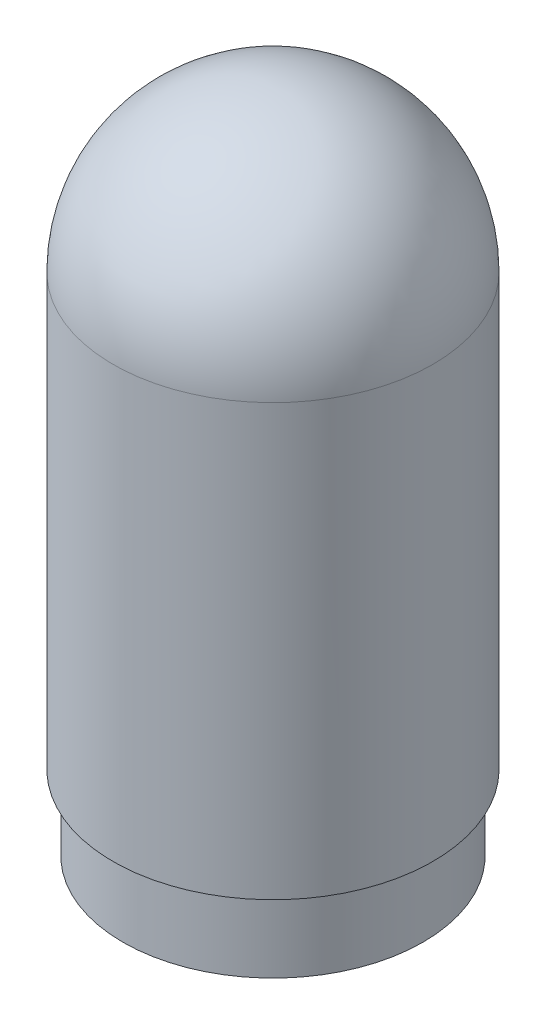
ISO-10303-21;
HEADER;
FILE_DESCRIPTION(('STEP AP214'),'2;1');
FILE_NAME('part.step','',(''),(''),'','','');
FILE_SCHEMA(('AUTOMOTIVE_DESIGN { 1 0 10303 214 1 1 1 1 }'));
ENDSEC;
DATA;
#1=APPLICATION_CONTEXT('core data for automotive mechanical design processes');
#2=APPLICATION_PROTOCOL_DEFINITION('international standard','automotive_design',2000,#1);
#3=PRODUCT_CONTEXT('',#1,'mechanical');
#4=PRODUCT('Part','Part','',(#3));
#5=PRODUCT_RELATED_PRODUCT_CATEGORY('part','',(#4));
#6=PRODUCT_DEFINITION_FORMATION('','',#4);
#7=PRODUCT_DEFINITION_CONTEXT('part definition',#1,'design');
#8=PRODUCT_DEFINITION('design','',#6,#7);
#9=PRODUCT_DEFINITION_SHAPE('','',#8);
#10=(LENGTH_UNIT() NAMED_UNIT(*) SI_UNIT(.MILLI.,.METRE.));
#11=(NAMED_UNIT(*) PLANE_ANGLE_UNIT() SI_UNIT($,.RADIAN.));
#12=(NAMED_UNIT(*) SI_UNIT($,.STERADIAN.) SOLID_ANGLE_UNIT());
#13=UNCERTAINTY_MEASURE_WITH_UNIT(LENGTH_MEASURE(1.E-05),#10,'distance_accuracy_value','');
#14=(GEOMETRIC_REPRESENTATION_CONTEXT(3) GLOBAL_UNCERTAINTY_ASSIGNED_CONTEXT((#13)) GLOBAL_UNIT_ASSIGNED_CONTEXT((#10,
#11,#12)) REPRESENTATION_CONTEXT('',''));
#15=CARTESIAN_POINT('',(0.,0.,0.));
#16=DIRECTION('',(0.,0.,1.));
#17=DIRECTION('',(1.,0.,0.));
#18=AXIS2_PLACEMENT_3D('',#15,#16,#17);
#19=CARTESIAN_POINT('',(0.,15.2089324232918,0.));
#20=DIRECTION('',(0.,-1.,0.));
#21=DIRECTION('',(0.,0.,-1.));
#22=AXIS2_PLACEMENT_3D('',#19,#20,#21);
#23=PLANE('',#22);
#24=CARTESIAN_POINT('',(0.,15.2089324232918,0.));
#25=DIRECTION('',(0.,-1.,0.));
#26=DIRECTION('',(0.,0.,-1.));
#27=AXIS2_PLACEMENT_3D('',#24,#25,#26);
#28=CIRCLE('',#27,32.5);
#29=CARTESIAN_POINT('',(0.,15.2089324232918,-32.5));
#30=VERTEX_POINT('',#29);
#31=EDGE_CURVE('E47',#30,#30,#28,.T.);
#32=ORIENTED_EDGE('',*,*,#31,.T.);
#33=EDGE_LOOP('',(#32));
#34=FACE_BOUND('',#33,.T.);
#35=CARTESIAN_POINT('',(0.,15.2089324232918,0.));
#36=DIRECTION('',(0.,-1.,0.));
#37=DIRECTION('',(0.,0.,-1.));
#38=AXIS2_PLACEMENT_3D('',#35,#36,#37);
#39=CIRCLE('',#38,22.5);
#40=CARTESIAN_POINT('',(0.,15.2089324232918,-22.5));
#41=VERTEX_POINT('',#40);
#42=EDGE_CURVE('E43',#41,#41,#39,.F.);
#43=ORIENTED_EDGE('',*,*,#42,.T.);
#44=EDGE_LOOP('',(#43));
#45=FACE_BOUND('',#44,.T.);
#46=ADVANCED_FACE('F39',(#34,#45),#23,.T.);
#47=CARTESIAN_POINT('',(0.,102.708932423279,0.));
#48=DIRECTION('',(0.,-1.,0.));
#49=DIRECTION('',(1.,0.,0.));
#50=AXIS2_PLACEMENT_3D('',#47,#48,#49);
#51=SPHERICAL_SURFACE('',#50,32.5000000000127);
#52=CARTESIAN_POINT('',(0.,102.708903729677,0.));
#53=DIRECTION('',(0.,-1.,0.));
#54=DIRECTION('',(0.,0.,-1.));
#55=AXIS2_PLACEMENT_3D('',#52,#53,#54);
#56=CIRCLE('',#55,32.5);
#57=CARTESIAN_POINT('',(0.,102.708903729677,-32.5));
#58=VERTEX_POINT('',#57);
#59=EDGE_CURVE('E11',#58,#58,#56,.T.);
#60=ORIENTED_EDGE('',*,*,#59,.F.);
#61=EDGE_LOOP('',(#60));
#62=FACE_BOUND('',#61,.T.);
#63=ADVANCED_FACE('F41',(#62),#51,.T.);
#64=CARTESIAN_POINT('',(0.,24.3003243252347,0.));
#65=DIRECTION('',(0.,-1.,0.));
#66=DIRECTION('',(0.,0.,-1.));
#67=AXIS2_PLACEMENT_3D('',#64,#65,#66);
#68=CYLINDRICAL_SURFACE('',#67,32.5);
#69=ORIENTED_EDGE('',*,*,#59,.T.);
#70=EDGE_LOOP('',(#69));
#71=FACE_BOUND('',#70,.T.);
#72=ORIENTED_EDGE('',*,*,#31,.F.);
#73=EDGE_LOOP('',(#72));
#74=FACE_BOUND('',#73,.T.);
#75=ADVANCED_FACE('F64',(#71,#74),#68,.T.);
#76=CARTESIAN_POINT('',(0.,102.708903729677,0.));
#77=DIRECTION('',(0.,1.,0.));
#78=DIRECTION('',(0.,0.,1.));
#79=AXIS2_PLACEMENT_3D('',#76,#77,#78);
#80=CYLINDRICAL_SURFACE('',#79,22.5);
#81=ORIENTED_EDGE('',*,*,#42,.F.);
#82=EDGE_LOOP('',(#81));
#83=FACE_BOUND('',#82,.T.);
#84=CARTESIAN_POINT('',(0.,102.708903729677,0.));
#85=DIRECTION('',(0.,1.,0.));
#86=DIRECTION('',(0.,0.,1.));
#87=AXIS2_PLACEMENT_3D('',#84,#85,#86);
#88=CIRCLE('',#87,22.5);
#89=CARTESIAN_POINT('',(0.,102.708903729677,22.5));
#90=VERTEX_POINT('',#89);
#91=EDGE_CURVE('E53',#90,#90,#88,.T.);
#92=ORIENTED_EDGE('',*,*,#91,.T.);
#93=EDGE_LOOP('',(#92));
#94=FACE_BOUND('',#93,.T.);
#95=ADVANCED_FACE('F61',(#83,#94),#80,.F.);
#96=CARTESIAN_POINT('',(-1.27849120179491E-11,102.708903729677,0.));
#97=DIRECTION('',(0.,1.,0.));
#98=DIRECTION('',(1.,0.,0.));
#99=AXIS2_PLACEMENT_3D('',#96,#97,#98);
#100=SPHERICAL_SURFACE('',#99,22.5000000000128);
#101=ORIENTED_EDGE('',*,*,#91,.F.);
#102=EDGE_LOOP('',(#101));
#103=FACE_BOUND('',#102,.T.);
#104=ADVANCED_FACE('F63',(#103),#100,.F.);
#105=CLOSED_SHELL('',(#46,#63,#75,#95,#104));
#106=MANIFOLD_SOLID_BREP('B2',#105);
#107=CARTESIAN_POINT('',(0.,15.,0.));
#108=DIRECTION('',(0.,1.,0.));
#109=DIRECTION('',(0.,0.,1.));
#110=AXIS2_PLACEMENT_3D('',#107,#108,#109);
#111=PLANE('',#110);
#112=CARTESIAN_POINT('',(0.,15.,0.));
#113=DIRECTION('',(0.,1.,0.));
#114=DIRECTION('',(0.,0.,1.));
#115=AXIS2_PLACEMENT_3D('',#112,#113,#114);
#116=CIRCLE('',#115,30.5);
#117=CARTESIAN_POINT('',(0.,15.,30.5));
#118=VERTEX_POINT('',#117);
#119=EDGE_CURVE('E38',#118,#118,#116,.T.);
#120=ORIENTED_EDGE('',*,*,#119,.T.);
#121=EDGE_LOOP('',(#120));
#122=FACE_BOUND('',#121,.T.);
#123=CARTESIAN_POINT('',(0.,15.,0.));
#124=DIRECTION('',(0.,1.,0.));
#125=DIRECTION('',(0.,0.,1.));
#126=AXIS2_PLACEMENT_3D('',#123,#124,#125);
#127=CIRCLE('',#126,22.5);
#128=CARTESIAN_POINT('',(0.,15.,22.5));
#129=VERTEX_POINT('',#128);
#130=EDGE_CURVE('E121',#129,#129,#127,.T.);
#131=ORIENTED_EDGE('',*,*,#130,.F.);
#132=EDGE_LOOP('',(#131));
#133=FACE_BOUND('',#132,.T.);
#134=ADVANCED_FACE('F110',(#122,#133),#111,.T.);
#135=CARTESIAN_POINT('',(0.,0.,0.));
#136=DIRECTION('',(0.,1.,0.));
#137=DIRECTION('',(0.,0.,1.));
#138=AXIS2_PLACEMENT_3D('',#135,#136,#137);
#139=PLANE('',#138);
#140=CARTESIAN_POINT('',(0.,0.,0.));
#141=DIRECTION('',(0.,1.,0.));
#142=DIRECTION('',(0.,0.,1.));
#143=AXIS2_PLACEMENT_3D('',#140,#141,#142);
#144=CIRCLE('',#143,30.5);
#145=CARTESIAN_POINT('',(0.,0.,30.5));
#146=VERTEX_POINT('',#145);
#147=EDGE_CURVE('E114',#146,#146,#144,.T.);
#148=ORIENTED_EDGE('',*,*,#147,.F.);
#149=EDGE_LOOP('',(#148));
#150=FACE_BOUND('',#149,.T.);
#151=CARTESIAN_POINT('',(0.,0.,0.));
#152=DIRECTION('',(0.,1.,0.));
#153=DIRECTION('',(0.,0.,1.));
#154=AXIS2_PLACEMENT_3D('',#151,#152,#153);
#155=CIRCLE('',#154,22.5);
#156=CARTESIAN_POINT('',(0.,0.,22.5));
#157=VERTEX_POINT('',#156);
#158=EDGE_CURVE('E123',#157,#157,#155,.T.);
#159=ORIENTED_EDGE('',*,*,#158,.T.);
#160=EDGE_LOOP('',(#159));
#161=FACE_BOUND('',#160,.T.);
#162=ADVANCED_FACE('F133',(#150,#161),#139,.F.);
#163=CARTESIAN_POINT('',(0.,15.,0.));
#164=DIRECTION('',(0.,-1.,0.));
#165=DIRECTION('',(0.,0.,-1.));
#166=AXIS2_PLACEMENT_3D('',#163,#164,#165);
#167=CYLINDRICAL_SURFACE('',#166,30.5);
#168=ORIENTED_EDGE('',*,*,#119,.F.);
#169=EDGE_LOOP('',(#168));
#170=FACE_BOUND('',#169,.T.);
#171=ORIENTED_EDGE('',*,*,#147,.T.);
#172=EDGE_LOOP('',(#171));
#173=FACE_BOUND('',#172,.T.);
#174=ADVANCED_FACE('F112',(#170,#173),#167,.T.);
#175=CARTESIAN_POINT('',(0.,15.,0.));
#176=DIRECTION('',(0.,-1.,0.));
#177=DIRECTION('',(0.,0.,-1.));
#178=AXIS2_PLACEMENT_3D('',#175,#176,#177);
#179=CYLINDRICAL_SURFACE('',#178,22.5);
#180=ORIENTED_EDGE('',*,*,#130,.T.);
#181=EDGE_LOOP('',(#180));
#182=FACE_BOUND('',#181,.T.);
#183=ORIENTED_EDGE('',*,*,#158,.F.);
#184=EDGE_LOOP('',(#183));
#185=FACE_BOUND('',#184,.T.);
#186=ADVANCED_FACE('F129',(#182,#185),#179,.F.);
#187=CLOSED_SHELL('',(#134,#162,#174,#186));
#188=MANIFOLD_SOLID_BREP('B6',#187);
#189=ADVANCED_BREP_SHAPE_REPRESENTATION('',(#18,#106,#188),#14);
#190=SHAPE_DEFINITION_REPRESENTATION(#9,#189);
ENDSEC;
END-ISO-10303-21;
